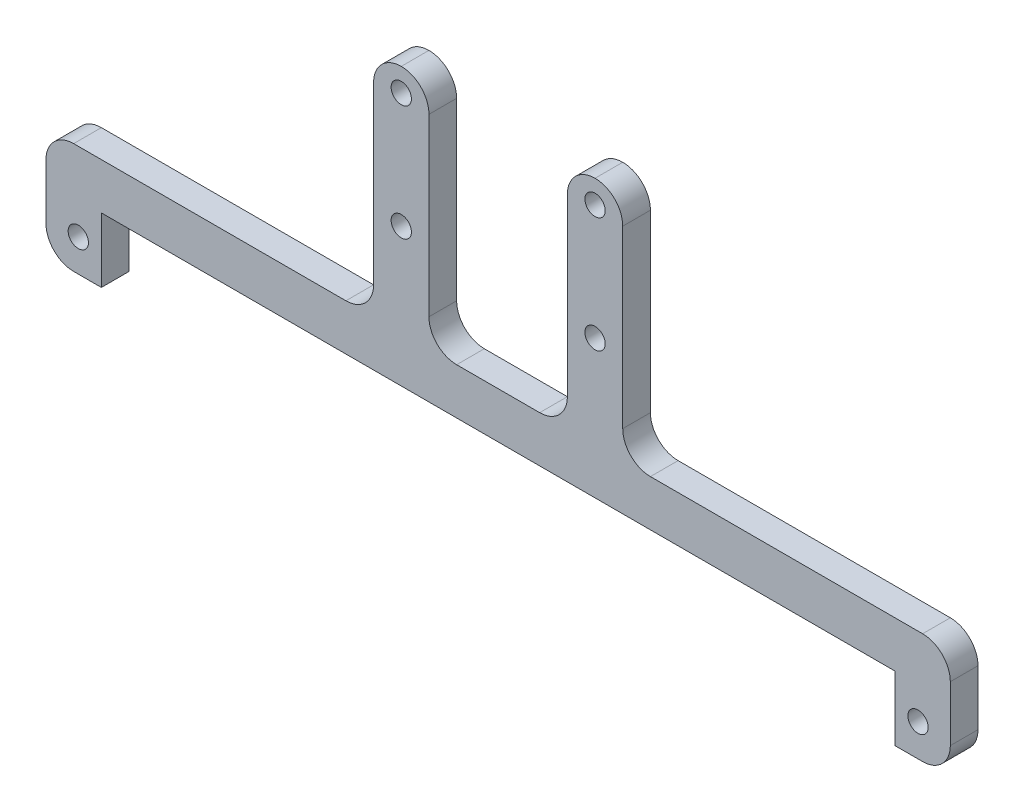
ISO-10303-21;
HEADER;
FILE_DESCRIPTION(('STEP AP214'),'2;1');
FILE_NAME('part.step','',(''),(''),'','','');
FILE_SCHEMA(('AUTOMOTIVE_DESIGN { 1 0 10303 214 1 1 1 1 }'));
ENDSEC;
DATA;
#1=APPLICATION_CONTEXT('core data for automotive mechanical design processes');
#2=APPLICATION_PROTOCOL_DEFINITION('international standard','automotive_design',2000,#1);
#3=PRODUCT_CONTEXT('',#1,'mechanical');
#4=PRODUCT('Part','Part','',(#3));
#5=PRODUCT_RELATED_PRODUCT_CATEGORY('part','',(#4));
#6=PRODUCT_DEFINITION_FORMATION('','',#4);
#7=PRODUCT_DEFINITION_CONTEXT('part definition',#1,'design');
#8=PRODUCT_DEFINITION('design','',#6,#7);
#9=PRODUCT_DEFINITION_SHAPE('','',#8);
#10=(LENGTH_UNIT() NAMED_UNIT(*) SI_UNIT(.MILLI.,.METRE.));
#11=(NAMED_UNIT(*) PLANE_ANGLE_UNIT() SI_UNIT($,.RADIAN.));
#12=(NAMED_UNIT(*) SI_UNIT($,.STERADIAN.) SOLID_ANGLE_UNIT());
#13=UNCERTAINTY_MEASURE_WITH_UNIT(LENGTH_MEASURE(1.E-05),#10,'distance_accuracy_value','');
#14=(GEOMETRIC_REPRESENTATION_CONTEXT(3) GLOBAL_UNCERTAINTY_ASSIGNED_CONTEXT((#13)) GLOBAL_UNIT_ASSIGNED_CONTEXT((#10,
#11,#12)) REPRESENTATION_CONTEXT('',''));
#15=CARTESIAN_POINT('',(0.,0.,0.));
#16=DIRECTION('',(0.,0.,1.));
#17=DIRECTION('',(1.,0.,0.));
#18=AXIS2_PLACEMENT_3D('',#15,#16,#17);
#19=CARTESIAN_POINT('',(0.,0.,3.));
#20=DIRECTION('',(0.,0.,-1.));
#21=DIRECTION('',(-1.,0.,0.));
#22=AXIS2_PLACEMENT_3D('',#19,#20,#21);
#23=PLANE('',#22);
#24=CARTESIAN_POINT('',(10.5,15.,3.));
#25=DIRECTION('',(0.,0.,-1.));
#26=DIRECTION('',(-1.,0.,0.));
#27=AXIS2_PLACEMENT_3D('',#24,#25,#26);
#28=CIRCLE('',#27,1.1);
#29=CARTESIAN_POINT('',(9.4,15.,3.));
#30=VERTEX_POINT('',#29);
#31=EDGE_CURVE('E503',#30,#30,#28,.T.);
#32=ORIENTED_EDGE('',*,*,#31,.T.);
#33=EDGE_LOOP('',(#32));
#34=FACE_BOUND('',#33,.T.);
#35=CARTESIAN_POINT('',(10.5,27.,3.));
#36=DIRECTION('',(0.,0.,-1.));
#37=DIRECTION('',(-1.,0.,0.));
#38=AXIS2_PLACEMENT_3D('',#35,#36,#37);
#39=CIRCLE('',#38,3.);
#40=CARTESIAN_POINT('',(13.5,27.,3.));
#41=VERTEX_POINT('',#40);
#42=CARTESIAN_POINT('',(10.5,30.,3.));
#43=VERTEX_POINT('',#42);
#44=EDGE_CURVE('E49',#41,#43,#39,.F.);
#45=ORIENTED_EDGE('',*,*,#44,.T.);
#46=CARTESIAN_POINT('',(10.5,27.,3.));
#47=DIRECTION('',(0.,0.,-1.));
#48=DIRECTION('',(-1.,0.,0.));
#49=AXIS2_PLACEMENT_3D('',#46,#47,#48);
#50=CIRCLE('',#49,3.);
#51=CARTESIAN_POINT('',(7.5,27.,3.));
#52=VERTEX_POINT('',#51);
#53=EDGE_CURVE('E392',#43,#52,#50,.F.);
#54=ORIENTED_EDGE('',*,*,#53,.T.);
#55=DIRECTION('',(0.,1.,0.));
#56=VECTOR('',#55,1.);
#57=CARTESIAN_POINT('',(7.5,5.,3.));
#58=LINE('',#57,#56);
#59=CARTESIAN_POINT('',(7.5,8.,3.));
#60=VERTEX_POINT('',#59);
#61=EDGE_CURVE('E230',#60,#52,#58,.T.);
#62=ORIENTED_EDGE('',*,*,#61,.F.);
#63=CARTESIAN_POINT('',(4.5,8.,3.));
#64=DIRECTION('',(0.,0.,-1.));
#65=DIRECTION('',(-1.,0.,0.));
#66=AXIS2_PLACEMENT_3D('',#63,#64,#65);
#67=CIRCLE('',#66,3.);
#68=CARTESIAN_POINT('',(4.5,5.,3.));
#69=VERTEX_POINT('',#68);
#70=EDGE_CURVE('E11',#60,#69,#67,.T.);
#71=ORIENTED_EDGE('',*,*,#70,.T.);
#72=DIRECTION('',(-1.,0.,0.));
#73=VECTOR('',#72,1.);
#74=CARTESIAN_POINT('',(0.,5.,3.));
#75=LINE('',#74,#73);
#76=CARTESIAN_POINT('',(-4.5,5.,3.));
#77=VERTEX_POINT('',#76);
#78=EDGE_CURVE('E269',#69,#77,#75,.T.);
#79=ORIENTED_EDGE('',*,*,#78,.T.);
#80=CARTESIAN_POINT('',(-4.5,8.,3.));
#81=DIRECTION('',(0.,0.,-1.));
#82=DIRECTION('',(-1.,0.,0.));
#83=AXIS2_PLACEMENT_3D('',#80,#81,#82);
#84=CIRCLE('',#83,3.);
#85=CARTESIAN_POINT('',(-7.5,8.,3.));
#86=VERTEX_POINT('',#85);
#87=EDGE_CURVE('E357',#77,#86,#84,.T.);
#88=ORIENTED_EDGE('',*,*,#87,.T.);
#89=DIRECTION('',(0.,1.,0.));
#90=VECTOR('',#89,1.);
#91=CARTESIAN_POINT('',(-7.5,5.,3.));
#92=LINE('',#91,#90);
#93=CARTESIAN_POINT('',(-7.5,27.,3.));
#94=VERTEX_POINT('',#93);
#95=EDGE_CURVE('E265',#86,#94,#92,.T.);
#96=ORIENTED_EDGE('',*,*,#95,.T.);
#97=CARTESIAN_POINT('',(-10.5,27.,3.));
#98=DIRECTION('',(0.,0.,-1.));
#99=DIRECTION('',(-1.,0.,0.));
#100=AXIS2_PLACEMENT_3D('',#97,#98,#99);
#101=CIRCLE('',#100,3.);
#102=CARTESIAN_POINT('',(-10.5,30.,3.));
#103=VERTEX_POINT('',#102);
#104=EDGE_CURVE('E340',#94,#103,#101,.F.);
#105=ORIENTED_EDGE('',*,*,#104,.T.);
#106=CARTESIAN_POINT('',(-10.5,27.,3.));
#107=DIRECTION('',(0.,0.,-1.));
#108=DIRECTION('',(-1.,0.,0.));
#109=AXIS2_PLACEMENT_3D('',#106,#107,#108);
#110=CIRCLE('',#109,3.);
#111=CARTESIAN_POINT('',(-13.5,27.,3.));
#112=VERTEX_POINT('',#111);
#113=EDGE_CURVE('E338',#103,#112,#110,.F.);
#114=ORIENTED_EDGE('',*,*,#113,.T.);
#115=DIRECTION('',(0.,1.,0.));
#116=VECTOR('',#115,1.);
#117=CARTESIAN_POINT('',(-13.5,4.99999999999999,3.));
#118=LINE('',#117,#116);
#119=CARTESIAN_POINT('',(-13.5,7.99999999999999,3.));
#120=VERTEX_POINT('',#119);
#121=EDGE_CURVE('E262',#120,#112,#118,.T.);
#122=ORIENTED_EDGE('',*,*,#121,.F.);
#123=CARTESIAN_POINT('',(-16.5,7.99999999999999,3.));
#124=DIRECTION('',(0.,0.,-1.));
#125=DIRECTION('',(-1.,0.,0.));
#126=AXIS2_PLACEMENT_3D('',#123,#124,#125);
#127=CIRCLE('',#126,3.);
#128=CARTESIAN_POINT('',(-16.5,5.,3.));
#129=VERTEX_POINT('',#128);
#130=EDGE_CURVE('E352',#120,#129,#127,.T.);
#131=ORIENTED_EDGE('',*,*,#130,.T.);
#132=DIRECTION('',(-1.,0.,0.));
#133=VECTOR('',#132,1.);
#134=CARTESIAN_POINT('',(-13.5,4.99999999999999,3.));
#135=LINE('',#134,#133);
#136=CARTESIAN_POINT('',(-46.,5.,3.));
#137=VERTEX_POINT('',#136);
#138=EDGE_CURVE('E280',#129,#137,#135,.T.);
#139=ORIENTED_EDGE('',*,*,#138,.T.);
#140=CARTESIAN_POINT('',(-46.,2.,3.));
#141=DIRECTION('',(0.,0.,-1.));
#142=DIRECTION('',(-1.,0.,0.));
#143=AXIS2_PLACEMENT_3D('',#140,#141,#142);
#144=CIRCLE('',#143,3.);
#145=CARTESIAN_POINT('',(-49.,2.,3.));
#146=VERTEX_POINT('',#145);
#147=EDGE_CURVE('E336',#137,#146,#144,.F.);
#148=ORIENTED_EDGE('',*,*,#147,.T.);
#149=DIRECTION('',(0.,-1.,0.));
#150=VECTOR('',#149,1.);
#151=CARTESIAN_POINT('',(-49.,0.,3.));
#152=LINE('',#151,#150);
#153=CARTESIAN_POINT('',(-49.,-4.,3.));
#154=VERTEX_POINT('',#153);
#155=EDGE_CURVE('E277',#146,#154,#152,.T.);
#156=ORIENTED_EDGE('',*,*,#155,.T.);
#157=CARTESIAN_POINT('',(-46.,-4.,3.));
#158=DIRECTION('',(0.,0.,-1.));
#159=DIRECTION('',(-1.,0.,0.));
#160=AXIS2_PLACEMENT_3D('',#157,#158,#159);
#161=CIRCLE('',#160,3.);
#162=CARTESIAN_POINT('',(-46.,-7.,3.));
#163=VERTEX_POINT('',#162);
#164=EDGE_CURVE('E334',#154,#163,#161,.F.);
#165=ORIENTED_EDGE('',*,*,#164,.T.);
#166=DIRECTION('',(1.,0.,0.));
#167=VECTOR('',#166,1.);
#168=CARTESIAN_POINT('',(-49.,-7.,3.));
#169=LINE('',#168,#167);
#170=CARTESIAN_POINT('',(-43.,-7.,3.));
#171=VERTEX_POINT('',#170);
#172=EDGE_CURVE('E275',#163,#171,#169,.T.);
#173=ORIENTED_EDGE('',*,*,#172,.T.);
#174=DIRECTION('',(0.,-1.,0.));
#175=VECTOR('',#174,1.);
#176=CARTESIAN_POINT('',(-43.,0.,3.));
#177=LINE('',#176,#175);
#178=CARTESIAN_POINT('',(-43.,0.,3.));
#179=VERTEX_POINT('',#178);
#180=EDGE_CURVE('E272',#179,#171,#177,.T.);
#181=ORIENTED_EDGE('',*,*,#180,.F.);
#182=DIRECTION('',(-1.,0.,0.));
#183=VECTOR('',#182,1.);
#184=CARTESIAN_POINT('',(0.,0.,3.));
#185=LINE('',#184,#183);
#186=CARTESIAN_POINT('',(43.,0.,3.));
#187=VERTEX_POINT('',#186);
#188=EDGE_CURVE('E226',#187,#179,#185,.T.);
#189=ORIENTED_EDGE('',*,*,#188,.F.);
#190=DIRECTION('',(0.,-1.,0.));
#191=VECTOR('',#190,1.);
#192=CARTESIAN_POINT('',(43.,0.,3.));
#193=LINE('',#192,#191);
#194=CARTESIAN_POINT('',(43.,-7.,3.));
#195=VERTEX_POINT('',#194);
#196=EDGE_CURVE('E219',#187,#195,#193,.T.);
#197=ORIENTED_EDGE('',*,*,#196,.T.);
#198=DIRECTION('',(-1.,0.,0.));
#199=VECTOR('',#198,1.);
#200=CARTESIAN_POINT('',(49.,-7.,3.));
#201=LINE('',#200,#199);
#202=CARTESIAN_POINT('',(46.,-7.,3.));
#203=VERTEX_POINT('',#202);
#204=EDGE_CURVE('E209',#203,#195,#201,.T.);
#205=ORIENTED_EDGE('',*,*,#204,.F.);
#206=CARTESIAN_POINT('',(46.,-4.,3.));
#207=DIRECTION('',(0.,0.,-1.));
#208=DIRECTION('',(-1.,0.,0.));
#209=AXIS2_PLACEMENT_3D('',#206,#207,#208);
#210=CIRCLE('',#209,3.);
#211=CARTESIAN_POINT('',(49.,-4.,3.));
#212=VERTEX_POINT('',#211);
#213=EDGE_CURVE('E387',#203,#212,#210,.F.);
#214=ORIENTED_EDGE('',*,*,#213,.T.);
#215=DIRECTION('',(0.,1.,0.));
#216=VECTOR('',#215,1.);
#217=CARTESIAN_POINT('',(49.,0.,3.));
#218=LINE('',#217,#216);
#219=CARTESIAN_POINT('',(49.,2.,3.));
#220=VERTEX_POINT('',#219);
#221=EDGE_CURVE('E220',#212,#220,#218,.T.);
#222=ORIENTED_EDGE('',*,*,#221,.T.);
#223=CARTESIAN_POINT('',(46.,2.,3.));
#224=DIRECTION('',(0.,0.,-1.));
#225=DIRECTION('',(-1.,0.,0.));
#226=AXIS2_PLACEMENT_3D('',#223,#224,#225);
#227=CIRCLE('',#226,3.);
#228=CARTESIAN_POINT('',(46.,5.,3.));
#229=VERTEX_POINT('',#228);
#230=EDGE_CURVE('E389',#220,#229,#227,.F.);
#231=ORIENTED_EDGE('',*,*,#230,.T.);
#232=DIRECTION('',(1.,0.,0.));
#233=VECTOR('',#232,1.);
#234=CARTESIAN_POINT('',(13.5,4.99999999999999,3.));
#235=LINE('',#234,#233);
#236=CARTESIAN_POINT('',(16.5,5.,3.));
#237=VERTEX_POINT('',#236);
#238=EDGE_CURVE('E493',#237,#229,#235,.T.);
#239=ORIENTED_EDGE('',*,*,#238,.F.);
#240=CARTESIAN_POINT('',(16.5,7.99999999999999,3.));
#241=DIRECTION('',(0.,0.,-1.));
#242=DIRECTION('',(-1.,0.,0.));
#243=AXIS2_PLACEMENT_3D('',#240,#241,#242);
#244=CIRCLE('',#243,3.);
#245=CARTESIAN_POINT('',(13.5,7.99999999999999,3.));
#246=VERTEX_POINT('',#245);
#247=EDGE_CURVE('E401',#237,#246,#244,.T.);
#248=ORIENTED_EDGE('',*,*,#247,.T.);
#249=DIRECTION('',(0.,1.,0.));
#250=VECTOR('',#249,1.);
#251=CARTESIAN_POINT('',(13.5,4.99999999999999,3.));
#252=LINE('',#251,#250);
#253=EDGE_CURVE('E417',#246,#41,#252,.T.);
#254=ORIENTED_EDGE('',*,*,#253,.T.);
#255=EDGE_LOOP('',(#45,#54,#62,#71,#79,#88,#96,#105,#114,#122,#131,#139,#148,#156,#165,#173,
#181,#189,#197,#205,#214,#222,#231,#239,#248,#254));
#256=FACE_BOUND('',#255,.T.);
#257=CARTESIAN_POINT('',(-45.5,-3.5,3.));
#258=DIRECTION('',(0.,0.,1.));
#259=DIRECTION('',(1.,0.,0.));
#260=AXIS2_PLACEMENT_3D('',#257,#258,#259);
#261=CIRCLE('',#260,1.1);
#262=CARTESIAN_POINT('',(-44.4,-3.5,3.));
#263=VERTEX_POINT('',#262);
#264=EDGE_CURVE('E253',#263,#263,#261,.T.);
#265=ORIENTED_EDGE('',*,*,#264,.F.);
#266=EDGE_LOOP('',(#265));
#267=FACE_BOUND('',#266,.T.);
#268=CARTESIAN_POINT('',(-10.5,15.,3.));
#269=DIRECTION('',(0.,0.,1.));
#270=DIRECTION('',(1.,0.,0.));
#271=AXIS2_PLACEMENT_3D('',#268,#269,#270);
#272=CIRCLE('',#271,1.1);
#273=CARTESIAN_POINT('',(-9.4,15.,3.));
#274=VERTEX_POINT('',#273);
#275=EDGE_CURVE('E246',#274,#274,#272,.T.);
#276=ORIENTED_EDGE('',*,*,#275,.F.);
#277=EDGE_LOOP('',(#276));
#278=FACE_BOUND('',#277,.T.);
#279=CARTESIAN_POINT('',(-10.5,27.5,3.));
#280=DIRECTION('',(0.,0.,1.));
#281=DIRECTION('',(1.,0.,0.));
#282=AXIS2_PLACEMENT_3D('',#279,#280,#281);
#283=CIRCLE('',#282,1.1);
#284=CARTESIAN_POINT('',(-9.4,27.5,3.));
#285=VERTEX_POINT('',#284);
#286=EDGE_CURVE('E247',#285,#285,#283,.T.);
#287=ORIENTED_EDGE('',*,*,#286,.F.);
#288=EDGE_LOOP('',(#287));
#289=FACE_BOUND('',#288,.T.);
#290=CARTESIAN_POINT('',(45.5,-3.5,3.));
#291=DIRECTION('',(0.,0.,-1.));
#292=DIRECTION('',(-1.,0.,0.));
#293=AXIS2_PLACEMENT_3D('',#290,#291,#292);
#294=CIRCLE('',#293,1.1);
#295=CARTESIAN_POINT('',(44.4,-3.5,3.));
#296=VERTEX_POINT('',#295);
#297=EDGE_CURVE('E497',#296,#296,#294,.T.);
#298=ORIENTED_EDGE('',*,*,#297,.T.);
#299=EDGE_LOOP('',(#298));
#300=FACE_BOUND('',#299,.T.);
#301=CARTESIAN_POINT('',(10.5,27.5,3.));
#302=DIRECTION('',(0.,0.,-1.));
#303=DIRECTION('',(-1.,0.,0.));
#304=AXIS2_PLACEMENT_3D('',#301,#302,#303);
#305=CIRCLE('',#304,1.1);
#306=CARTESIAN_POINT('',(9.4,27.5,3.));
#307=VERTEX_POINT('',#306);
#308=EDGE_CURVE('E509',#307,#307,#305,.T.);
#309=ORIENTED_EDGE('',*,*,#308,.T.);
#310=EDGE_LOOP('',(#309));
#311=FACE_BOUND('',#310,.T.);
#312=ADVANCED_FACE('F33',(#34,#256,#267,#278,#289,#300,#311),#23,.F.);
#313=CARTESIAN_POINT('',(0.,0.,0.));
#314=DIRECTION('',(0.,0.,-1.));
#315=DIRECTION('',(-1.,0.,0.));
#316=AXIS2_PLACEMENT_3D('',#313,#314,#315);
#317=PLANE('',#316);
#318=CARTESIAN_POINT('',(10.5,15.,0.));
#319=DIRECTION('',(0.,0.,-1.));
#320=DIRECTION('',(-1.,0.,0.));
#321=AXIS2_PLACEMENT_3D('',#318,#319,#320);
#322=CIRCLE('',#321,1.1);
#323=CARTESIAN_POINT('',(9.4,15.,0.));
#324=VERTEX_POINT('',#323);
#325=EDGE_CURVE('E500',#324,#324,#322,.T.);
#326=ORIENTED_EDGE('',*,*,#325,.F.);
#327=EDGE_LOOP('',(#326));
#328=FACE_BOUND('',#327,.T.);
#329=DIRECTION('',(0.,1.,0.));
#330=VECTOR('',#329,1.);
#331=CARTESIAN_POINT('',(7.5,5.,0.));
#332=LINE('',#331,#330);
#333=CARTESIAN_POINT('',(7.5,8.,0.));
#334=VERTEX_POINT('',#333);
#335=CARTESIAN_POINT('',(7.5,27.,0.));
#336=VERTEX_POINT('',#335);
#337=EDGE_CURVE('E409',#334,#336,#332,.T.);
#338=ORIENTED_EDGE('',*,*,#337,.T.);
#339=CARTESIAN_POINT('',(10.5,27.,0.));
#340=DIRECTION('',(0.,0.,-1.));
#341=DIRECTION('',(-1.,0.,0.));
#342=AXIS2_PLACEMENT_3D('',#339,#340,#341);
#343=CIRCLE('',#342,3.);
#344=CARTESIAN_POINT('',(10.5,30.,0.));
#345=VERTEX_POINT('',#344);
#346=EDGE_CURVE('E385',#336,#345,#343,.T.);
#347=ORIENTED_EDGE('',*,*,#346,.T.);
#348=CARTESIAN_POINT('',(10.5,27.,0.));
#349=DIRECTION('',(0.,0.,-1.));
#350=DIRECTION('',(-1.,0.,0.));
#351=AXIS2_PLACEMENT_3D('',#348,#349,#350);
#352=CIRCLE('',#351,3.);
#353=CARTESIAN_POINT('',(13.5,27.,0.));
#354=VERTEX_POINT('',#353);
#355=EDGE_CURVE('E383',#345,#354,#352,.T.);
#356=ORIENTED_EDGE('',*,*,#355,.T.);
#357=DIRECTION('',(0.,1.,0.));
#358=VECTOR('',#357,1.);
#359=CARTESIAN_POINT('',(13.5,4.99999999999999,0.));
#360=LINE('',#359,#358);
#361=CARTESIAN_POINT('',(13.5,7.99999999999999,0.));
#362=VERTEX_POINT('',#361);
#363=EDGE_CURVE('E488',#362,#354,#360,.T.);
#364=ORIENTED_EDGE('',*,*,#363,.F.);
#365=CARTESIAN_POINT('',(16.5,7.99999999999999,0.));
#366=DIRECTION('',(0.,0.,-1.));
#367=DIRECTION('',(-1.,0.,0.));
#368=AXIS2_PLACEMENT_3D('',#365,#366,#367);
#369=CIRCLE('',#368,3.);
#370=CARTESIAN_POINT('',(16.5,5.,0.));
#371=VERTEX_POINT('',#370);
#372=EDGE_CURVE('E399',#362,#371,#369,.F.);
#373=ORIENTED_EDGE('',*,*,#372,.T.);
#374=DIRECTION('',(1.,0.,0.));
#375=VECTOR('',#374,1.);
#376=CARTESIAN_POINT('',(13.5,4.99999999999999,0.));
#377=LINE('',#376,#375);
#378=CARTESIAN_POINT('',(46.,5.,0.));
#379=VERTEX_POINT('',#378);
#380=EDGE_CURVE('E485',#371,#379,#377,.T.);
#381=ORIENTED_EDGE('',*,*,#380,.T.);
#382=CARTESIAN_POINT('',(46.,2.,0.));
#383=DIRECTION('',(0.,0.,-1.));
#384=DIRECTION('',(-1.,0.,0.));
#385=AXIS2_PLACEMENT_3D('',#382,#383,#384);
#386=CIRCLE('',#385,3.);
#387=CARTESIAN_POINT('',(49.,2.,0.));
#388=VERTEX_POINT('',#387);
#389=EDGE_CURVE('E381',#379,#388,#386,.T.);
#390=ORIENTED_EDGE('',*,*,#389,.T.);
#391=DIRECTION('',(0.,-1.,0.));
#392=VECTOR('',#391,1.);
#393=CARTESIAN_POINT('',(49.,0.,0.));
#394=LINE('',#393,#392);
#395=CARTESIAN_POINT('',(49.,-4.,0.));
#396=VERTEX_POINT('',#395);
#397=EDGE_CURVE('E480',#388,#396,#394,.T.);
#398=ORIENTED_EDGE('',*,*,#397,.T.);
#399=CARTESIAN_POINT('',(46.,-4.,0.));
#400=DIRECTION('',(0.,0.,-1.));
#401=DIRECTION('',(-1.,0.,0.));
#402=AXIS2_PLACEMENT_3D('',#399,#400,#401);
#403=CIRCLE('',#402,3.);
#404=CARTESIAN_POINT('',(46.,-7.,0.));
#405=VERTEX_POINT('',#404);
#406=EDGE_CURVE('E379',#396,#405,#403,.T.);
#407=ORIENTED_EDGE('',*,*,#406,.T.);
#408=DIRECTION('',(-1.,0.,0.));
#409=VECTOR('',#408,1.);
#410=CARTESIAN_POINT('',(49.,-7.,0.));
#411=LINE('',#410,#409);
#412=CARTESIAN_POINT('',(43.,-7.,0.));
#413=VERTEX_POINT('',#412);
#414=EDGE_CURVE('E478',#405,#413,#411,.T.);
#415=ORIENTED_EDGE('',*,*,#414,.T.);
#416=DIRECTION('',(0.,-1.,0.));
#417=VECTOR('',#416,1.);
#418=CARTESIAN_POINT('',(43.,0.,0.));
#419=LINE('',#418,#417);
#420=CARTESIAN_POINT('',(43.,0.,0.));
#421=VERTEX_POINT('',#420);
#422=EDGE_CURVE('E234',#421,#413,#419,.T.);
#423=ORIENTED_EDGE('',*,*,#422,.F.);
#424=DIRECTION('',(-1.,0.,0.));
#425=VECTOR('',#424,1.);
#426=CARTESIAN_POINT('',(0.,0.,0.));
#427=LINE('',#426,#425);
#428=CARTESIAN_POINT('',(-43.,0.,0.));
#429=VERTEX_POINT('',#428);
#430=EDGE_CURVE('E291',#421,#429,#427,.T.);
#431=ORIENTED_EDGE('',*,*,#430,.T.);
#432=DIRECTION('',(0.,-1.,0.));
#433=VECTOR('',#432,1.);
#434=CARTESIAN_POINT('',(-43.,0.,0.));
#435=LINE('',#434,#433);
#436=CARTESIAN_POINT('',(-43.,-7.,0.));
#437=VERTEX_POINT('',#436);
#438=EDGE_CURVE('E294',#429,#437,#435,.T.);
#439=ORIENTED_EDGE('',*,*,#438,.T.);
#440=DIRECTION('',(1.,0.,0.));
#441=VECTOR('',#440,1.);
#442=CARTESIAN_POINT('',(-49.,-7.,0.));
#443=LINE('',#442,#441);
#444=CARTESIAN_POINT('',(-46.,-7.,0.));
#445=VERTEX_POINT('',#444);
#446=EDGE_CURVE('E297',#445,#437,#443,.T.);
#447=ORIENTED_EDGE('',*,*,#446,.F.);
#448=CARTESIAN_POINT('',(-46.,-4.,0.));
#449=DIRECTION('',(0.,0.,-1.));
#450=DIRECTION('',(-1.,0.,0.));
#451=AXIS2_PLACEMENT_3D('',#448,#449,#450);
#452=CIRCLE('',#451,3.);
#453=CARTESIAN_POINT('',(-49.,-4.,0.));
#454=VERTEX_POINT('',#453);
#455=EDGE_CURVE('E326',#445,#454,#452,.T.);
#456=ORIENTED_EDGE('',*,*,#455,.T.);
#457=DIRECTION('',(0.,1.,0.));
#458=VECTOR('',#457,1.);
#459=CARTESIAN_POINT('',(-49.,0.,0.));
#460=LINE('',#459,#458);
#461=CARTESIAN_POINT('',(-49.,2.,0.));
#462=VERTEX_POINT('',#461);
#463=EDGE_CURVE('E299',#454,#462,#460,.T.);
#464=ORIENTED_EDGE('',*,*,#463,.T.);
#465=CARTESIAN_POINT('',(-46.,2.,0.));
#466=DIRECTION('',(0.,0.,-1.));
#467=DIRECTION('',(-1.,0.,0.));
#468=AXIS2_PLACEMENT_3D('',#465,#466,#467);
#469=CIRCLE('',#468,3.);
#470=CARTESIAN_POINT('',(-46.,5.,0.));
#471=VERTEX_POINT('',#470);
#472=EDGE_CURVE('E328',#462,#471,#469,.T.);
#473=ORIENTED_EDGE('',*,*,#472,.T.);
#474=DIRECTION('',(-1.,0.,0.));
#475=VECTOR('',#474,1.);
#476=CARTESIAN_POINT('',(-13.5,4.99999999999999,0.));
#477=LINE('',#476,#475);
#478=CARTESIAN_POINT('',(-16.5,5.,0.));
#479=VERTEX_POINT('',#478);
#480=EDGE_CURVE('E266',#479,#471,#477,.T.);
#481=ORIENTED_EDGE('',*,*,#480,.F.);
#482=CARTESIAN_POINT('',(-16.5,7.99999999999999,0.));
#483=DIRECTION('',(0.,0.,-1.));
#484=DIRECTION('',(-1.,0.,0.));
#485=AXIS2_PLACEMENT_3D('',#482,#483,#484);
#486=CIRCLE('',#485,3.);
#487=CARTESIAN_POINT('',(-13.5,7.99999999999999,0.));
#488=VERTEX_POINT('',#487);
#489=EDGE_CURVE('E350',#479,#488,#486,.F.);
#490=ORIENTED_EDGE('',*,*,#489,.T.);
#491=DIRECTION('',(0.,1.,0.));
#492=VECTOR('',#491,1.);
#493=CARTESIAN_POINT('',(-13.5,4.99999999999999,0.));
#494=LINE('',#493,#492);
#495=CARTESIAN_POINT('',(-13.5,27.,0.));
#496=VERTEX_POINT('',#495);
#497=EDGE_CURVE('E259',#488,#496,#494,.T.);
#498=ORIENTED_EDGE('',*,*,#497,.T.);
#499=CARTESIAN_POINT('',(-10.5,27.,0.));
#500=DIRECTION('',(0.,0.,-1.));
#501=DIRECTION('',(-1.,0.,0.));
#502=AXIS2_PLACEMENT_3D('',#499,#500,#501);
#503=CIRCLE('',#502,3.);
#504=CARTESIAN_POINT('',(-10.5,30.,0.));
#505=VERTEX_POINT('',#504);
#506=EDGE_CURVE('E330',#496,#505,#503,.T.);
#507=ORIENTED_EDGE('',*,*,#506,.T.);
#508=CARTESIAN_POINT('',(-10.5,27.,0.));
#509=DIRECTION('',(0.,0.,-1.));
#510=DIRECTION('',(-1.,0.,0.));
#511=AXIS2_PLACEMENT_3D('',#508,#509,#510);
#512=CIRCLE('',#511,3.);
#513=CARTESIAN_POINT('',(-7.5,27.,0.));
#514=VERTEX_POINT('',#513);
#515=EDGE_CURVE('E332',#505,#514,#512,.T.);
#516=ORIENTED_EDGE('',*,*,#515,.T.);
#517=DIRECTION('',(0.,1.,0.));
#518=VECTOR('',#517,1.);
#519=CARTESIAN_POINT('',(-7.5,5.,0.));
#520=LINE('',#519,#518);
#521=CARTESIAN_POINT('',(-7.5,8.,0.));
#522=VERTEX_POINT('',#521);
#523=EDGE_CURVE('E286',#522,#514,#520,.T.);
#524=ORIENTED_EDGE('',*,*,#523,.F.);
#525=CARTESIAN_POINT('',(-4.5,8.,0.));
#526=DIRECTION('',(0.,0.,-1.));
#527=DIRECTION('',(-1.,0.,0.));
#528=AXIS2_PLACEMENT_3D('',#525,#526,#527);
#529=CIRCLE('',#528,3.);
#530=CARTESIAN_POINT('',(-4.5,5.,0.));
#531=VERTEX_POINT('',#530);
#532=EDGE_CURVE('E354',#522,#531,#529,.F.);
#533=ORIENTED_EDGE('',*,*,#532,.T.);
#534=DIRECTION('',(-1.,0.,0.));
#535=VECTOR('',#534,1.);
#536=CARTESIAN_POINT('',(0.,5.,0.));
#537=LINE('',#536,#535);
#538=CARTESIAN_POINT('',(4.5,5.,0.));
#539=VERTEX_POINT('',#538);
#540=EDGE_CURVE('E289',#539,#531,#537,.T.);
#541=ORIENTED_EDGE('',*,*,#540,.F.);
#542=CARTESIAN_POINT('',(4.5,8.,0.));
#543=DIRECTION('',(0.,0.,-1.));
#544=DIRECTION('',(-1.,0.,0.));
#545=AXIS2_PLACEMENT_3D('',#542,#543,#544);
#546=CIRCLE('',#545,3.);
#547=EDGE_CURVE('E42',#539,#334,#546,.F.);
#548=ORIENTED_EDGE('',*,*,#547,.T.);
#549=EDGE_LOOP('',(#338,#347,#356,#364,#373,#381,#390,#398,#407,#415,#423,#431,#439,#447,#456,
#464,#473,#481,#490,#498,#507,#516,#524,#533,#541,#548));
#550=FACE_BOUND('',#549,.T.);
#551=CARTESIAN_POINT('',(-45.5,-3.5,0.));
#552=DIRECTION('',(0.,0.,1.));
#553=DIRECTION('',(1.,0.,0.));
#554=AXIS2_PLACEMENT_3D('',#551,#552,#553);
#555=CIRCLE('',#554,1.1);
#556=CARTESIAN_POINT('',(-44.4,-3.5,0.));
#557=VERTEX_POINT('',#556);
#558=EDGE_CURVE('E256',#557,#557,#555,.T.);
#559=ORIENTED_EDGE('',*,*,#558,.T.);
#560=EDGE_LOOP('',(#559));
#561=FACE_BOUND('',#560,.T.);
#562=CARTESIAN_POINT('',(-10.5,15.,0.));
#563=DIRECTION('',(0.,0.,1.));
#564=DIRECTION('',(1.,0.,0.));
#565=AXIS2_PLACEMENT_3D('',#562,#563,#564);
#566=CIRCLE('',#565,1.1);
#567=CARTESIAN_POINT('',(-9.4,15.,0.));
#568=VERTEX_POINT('',#567);
#569=EDGE_CURVE('E250',#568,#568,#566,.T.);
#570=ORIENTED_EDGE('',*,*,#569,.T.);
#571=EDGE_LOOP('',(#570));
#572=FACE_BOUND('',#571,.T.);
#573=CARTESIAN_POINT('',(-10.5,27.5,0.));
#574=DIRECTION('',(0.,0.,1.));
#575=DIRECTION('',(1.,0.,0.));
#576=AXIS2_PLACEMENT_3D('',#573,#574,#575);
#577=CIRCLE('',#576,1.1);
#578=CARTESIAN_POINT('',(-9.4,27.5,0.));
#579=VERTEX_POINT('',#578);
#580=EDGE_CURVE('E243',#579,#579,#577,.T.);
#581=ORIENTED_EDGE('',*,*,#580,.T.);
#582=EDGE_LOOP('',(#581));
#583=FACE_BOUND('',#582,.T.);
#584=CARTESIAN_POINT('',(45.5,-3.5,0.));
#585=DIRECTION('',(0.,0.,-1.));
#586=DIRECTION('',(-1.,0.,0.));
#587=AXIS2_PLACEMENT_3D('',#584,#585,#586);
#588=CIRCLE('',#587,1.1);
#589=CARTESIAN_POINT('',(44.4,-3.5,0.));
#590=VERTEX_POINT('',#589);
#591=EDGE_CURVE('E490',#590,#590,#588,.T.);
#592=ORIENTED_EDGE('',*,*,#591,.F.);
#593=EDGE_LOOP('',(#592));
#594=FACE_BOUND('',#593,.T.);
#595=CARTESIAN_POINT('',(10.5,27.5,0.));
#596=DIRECTION('',(0.,0.,-1.));
#597=DIRECTION('',(-1.,0.,0.));
#598=AXIS2_PLACEMENT_3D('',#595,#596,#597);
#599=CIRCLE('',#598,1.1);
#600=CARTESIAN_POINT('',(9.4,27.5,0.));
#601=VERTEX_POINT('',#600);
#602=EDGE_CURVE('E506',#601,#601,#599,.T.);
#603=ORIENTED_EDGE('',*,*,#602,.F.);
#604=EDGE_LOOP('',(#603));
#605=FACE_BOUND('',#604,.T.);
#606=ADVANCED_FACE('F407',(#328,#550,#561,#572,#583,#594,#605),#317,.T.);
#607=CARTESIAN_POINT('',(-13.5,4.99999999999999,3.));
#608=DIRECTION('',(-1.,0.,0.));
#609=DIRECTION('',(0.,0.,1.));
#610=AXIS2_PLACEMENT_3D('',#607,#608,#609);
#611=PLANE('',#610);
#612=ORIENTED_EDGE('',*,*,#497,.F.);
#613=DIRECTION('',(0.,0.,-1.));
#614=VECTOR('',#613,1.);
#615=CARTESIAN_POINT('',(-13.5,7.99999999999999,3.));
#616=LINE('',#615,#614);
#617=EDGE_CURVE('E315',#488,#120,#616,.F.);
#618=ORIENTED_EDGE('',*,*,#617,.T.);
#619=ORIENTED_EDGE('',*,*,#121,.T.);
#620=DIRECTION('',(0.,0.,-1.));
#621=VECTOR('',#620,1.);
#622=CARTESIAN_POINT('',(-13.5,27.,3.));
#623=LINE('',#622,#621);
#624=EDGE_CURVE('E313',#112,#496,#623,.T.);
#625=ORIENTED_EDGE('',*,*,#624,.T.);
#626=EDGE_LOOP('',(#612,#618,#619,#625));
#627=FACE_BOUND('',#626,.T.);
#628=ADVANCED_FACE('F445',(#627),#611,.T.);
#629=CARTESIAN_POINT('',(-13.5,4.99999999999999,3.));
#630=DIRECTION('',(0.,-1.,0.));
#631=DIRECTION('',(1.,0.,0.));
#632=AXIS2_PLACEMENT_3D('',#629,#630,#631);
#633=PLANE('',#632);
#634=ORIENTED_EDGE('',*,*,#138,.F.);
#635=DIRECTION('',(0.,0.,-1.));
#636=VECTOR('',#635,1.);
#637=CARTESIAN_POINT('',(-16.5,5.,3.));
#638=LINE('',#637,#636);
#639=EDGE_CURVE('E310',#129,#479,#638,.T.);
#640=ORIENTED_EDGE('',*,*,#639,.T.);
#641=ORIENTED_EDGE('',*,*,#480,.T.);
#642=DIRECTION('',(0.,0.,-1.));
#643=VECTOR('',#642,1.);
#644=CARTESIAN_POINT('',(-46.,5.,3.));
#645=LINE('',#644,#643);
#646=EDGE_CURVE('E307',#471,#137,#645,.F.);
#647=ORIENTED_EDGE('',*,*,#646,.T.);
#648=EDGE_LOOP('',(#634,#640,#641,#647));
#649=FACE_BOUND('',#648,.T.);
#650=ADVANCED_FACE('F454',(#649),#633,.F.);
#651=CARTESIAN_POINT('',(-49.,0.,3.));
#652=DIRECTION('',(-1.,0.,0.));
#653=DIRECTION('',(0.,0.,1.));
#654=AXIS2_PLACEMENT_3D('',#651,#652,#653);
#655=PLANE('',#654);
#656=ORIENTED_EDGE('',*,*,#155,.F.);
#657=DIRECTION('',(0.,0.,-1.));
#658=VECTOR('',#657,1.);
#659=CARTESIAN_POINT('',(-49.,2.,0.));
#660=LINE('',#659,#658);
#661=EDGE_CURVE('E344',#146,#462,#660,.T.);
#662=ORIENTED_EDGE('',*,*,#661,.T.);
#663=ORIENTED_EDGE('',*,*,#463,.F.);
#664=DIRECTION('',(0.,0.,-1.));
#665=VECTOR('',#664,1.);
#666=CARTESIAN_POINT('',(-49.,-4.,3.));
#667=LINE('',#666,#665);
#668=EDGE_CURVE('E342',#454,#154,#667,.F.);
#669=ORIENTED_EDGE('',*,*,#668,.T.);
#670=EDGE_LOOP('',(#656,#662,#663,#669));
#671=FACE_BOUND('',#670,.T.);
#672=ADVANCED_FACE('F463',(#671),#655,.T.);
#673=CARTESIAN_POINT('',(-49.,-7.,3.));
#674=DIRECTION('',(0.,1.,0.));
#675=DIRECTION('',(0.,0.,1.));
#676=AXIS2_PLACEMENT_3D('',#673,#674,#675);
#677=PLANE('',#676);
#678=ORIENTED_EDGE('',*,*,#172,.F.);
#679=DIRECTION('',(0.,0.,-1.));
#680=VECTOR('',#679,1.);
#681=CARTESIAN_POINT('',(-46.,-7.,0.));
#682=LINE('',#681,#680);
#683=EDGE_CURVE('E347',#163,#445,#682,.T.);
#684=ORIENTED_EDGE('',*,*,#683,.T.);
#685=ORIENTED_EDGE('',*,*,#446,.T.);
#686=DIRECTION('',(0.,0.,-1.));
#687=VECTOR('',#686,1.);
#688=CARTESIAN_POINT('',(-43.,-7.,3.));
#689=LINE('',#688,#687);
#690=EDGE_CURVE('E304',#171,#437,#689,.T.);
#691=ORIENTED_EDGE('',*,*,#690,.F.);
#692=EDGE_LOOP('',(#678,#684,#685,#691));
#693=FACE_BOUND('',#692,.T.);
#694=ADVANCED_FACE('F472',(#693),#677,.F.);
#695=CARTESIAN_POINT('',(-43.,0.,3.));
#696=DIRECTION('',(1.,0.,0.));
#697=DIRECTION('',(0.,0.,-1.));
#698=AXIS2_PLACEMENT_3D('',#695,#696,#697);
#699=PLANE('',#698);
#700=ORIENTED_EDGE('',*,*,#438,.F.);
#701=DIRECTION('',(0.,0.,-1.));
#702=VECTOR('',#701,1.);
#703=CARTESIAN_POINT('',(-43.,0.,3.));
#704=LINE('',#703,#702);
#705=EDGE_CURVE('E283',#179,#429,#704,.T.);
#706=ORIENTED_EDGE('',*,*,#705,.F.);
#707=ORIENTED_EDGE('',*,*,#180,.T.);
#708=ORIENTED_EDGE('',*,*,#690,.T.);
#709=EDGE_LOOP('',(#700,#706,#707,#708));
#710=FACE_BOUND('',#709,.T.);
#711=ADVANCED_FACE('F538',(#710),#699,.T.);
#712=CARTESIAN_POINT('',(0.,0.,3.));
#713=DIRECTION('',(0.,-1.,0.));
#714=DIRECTION('',(1.,0.,0.));
#715=AXIS2_PLACEMENT_3D('',#712,#713,#714);
#716=PLANE('',#715);
#717=ORIENTED_EDGE('',*,*,#430,.F.);
#718=DIRECTION('',(0.,0.,-1.));
#719=VECTOR('',#718,1.);
#720=CARTESIAN_POINT('',(43.,0.,3.));
#721=LINE('',#720,#719);
#722=EDGE_CURVE('E235',#187,#421,#721,.T.);
#723=ORIENTED_EDGE('',*,*,#722,.F.);
#724=ORIENTED_EDGE('',*,*,#188,.T.);
#725=ORIENTED_EDGE('',*,*,#705,.T.);
#726=EDGE_LOOP('',(#717,#723,#724,#725));
#727=FACE_BOUND('',#726,.T.);
#728=ADVANCED_FACE('F476',(#727),#716,.T.);
#729=CARTESIAN_POINT('',(0.,5.,3.));
#730=DIRECTION('',(0.,-1.,0.));
#731=DIRECTION('',(1.,0.,0.));
#732=AXIS2_PLACEMENT_3D('',#729,#730,#731);
#733=PLANE('',#732);
#734=ORIENTED_EDGE('',*,*,#78,.F.);
#735=DIRECTION('',(0.,0.,-1.));
#736=VECTOR('',#735,1.);
#737=CARTESIAN_POINT('',(4.5,5.,3.));
#738=LINE('',#737,#736);
#739=EDGE_CURVE('E371',#69,#539,#738,.T.);
#740=ORIENTED_EDGE('',*,*,#739,.T.);
#741=ORIENTED_EDGE('',*,*,#540,.T.);
#742=DIRECTION('',(0.,0.,-1.));
#743=VECTOR('',#742,1.);
#744=CARTESIAN_POINT('',(-4.5,5.,3.));
#745=LINE('',#744,#743);
#746=EDGE_CURVE('E323',#531,#77,#745,.F.);
#747=ORIENTED_EDGE('',*,*,#746,.T.);
#748=EDGE_LOOP('',(#734,#740,#741,#747));
#749=FACE_BOUND('',#748,.T.);
#750=ADVANCED_FACE('F422',(#749),#733,.F.);
#751=CARTESIAN_POINT('',(-7.5,5.,3.));
#752=DIRECTION('',(-1.,0.,0.));
#753=DIRECTION('',(0.,0.,1.));
#754=AXIS2_PLACEMENT_3D('',#751,#752,#753);
#755=PLANE('',#754);
#756=ORIENTED_EDGE('',*,*,#95,.F.);
#757=DIRECTION('',(0.,0.,-1.));
#758=VECTOR('',#757,1.);
#759=CARTESIAN_POINT('',(-7.5,8.,0.));
#760=LINE('',#759,#758);
#761=EDGE_CURVE('E320',#86,#522,#760,.T.);
#762=ORIENTED_EDGE('',*,*,#761,.T.);
#763=ORIENTED_EDGE('',*,*,#523,.T.);
#764=DIRECTION('',(0.,0.,-1.));
#765=VECTOR('',#764,1.);
#766=CARTESIAN_POINT('',(-7.5,27.,3.));
#767=LINE('',#766,#765);
#768=EDGE_CURVE('E317',#514,#94,#767,.F.);
#769=ORIENTED_EDGE('',*,*,#768,.T.);
#770=EDGE_LOOP('',(#756,#762,#763,#769));
#771=FACE_BOUND('',#770,.T.);
#772=ADVANCED_FACE('F430',(#771),#755,.F.);
#773=CARTESIAN_POINT('',(-45.5,-3.5,0.));
#774=DIRECTION('',(0.,0.,1.));
#775=DIRECTION('',(1.,0.,0.));
#776=AXIS2_PLACEMENT_3D('',#773,#774,#775);
#777=CYLINDRICAL_SURFACE('',#776,1.1);
#778=ORIENTED_EDGE('',*,*,#558,.F.);
#779=EDGE_LOOP('',(#778));
#780=FACE_BOUND('',#779,.T.);
#781=ORIENTED_EDGE('',*,*,#264,.T.);
#782=EDGE_LOOP('',(#781));
#783=FACE_BOUND('',#782,.T.);
#784=ADVANCED_FACE('F545',(#780,#783),#777,.F.);
#785=CARTESIAN_POINT('',(-10.5,15.,0.));
#786=DIRECTION('',(0.,0.,1.));
#787=DIRECTION('',(1.,0.,0.));
#788=AXIS2_PLACEMENT_3D('',#785,#786,#787);
#789=CYLINDRICAL_SURFACE('',#788,1.1);
#790=ORIENTED_EDGE('',*,*,#569,.F.);
#791=EDGE_LOOP('',(#790));
#792=FACE_BOUND('',#791,.T.);
#793=ORIENTED_EDGE('',*,*,#275,.T.);
#794=EDGE_LOOP('',(#793));
#795=FACE_BOUND('',#794,.T.);
#796=ADVANCED_FACE('F614',(#792,#795),#789,.F.);
#797=CARTESIAN_POINT('',(-10.5,27.5,0.));
#798=DIRECTION('',(0.,0.,1.));
#799=DIRECTION('',(1.,0.,0.));
#800=AXIS2_PLACEMENT_3D('',#797,#798,#799);
#801=CYLINDRICAL_SURFACE('',#800,1.1);
#802=ORIENTED_EDGE('',*,*,#580,.F.);
#803=EDGE_LOOP('',(#802));
#804=FACE_BOUND('',#803,.T.);
#805=ORIENTED_EDGE('',*,*,#286,.T.);
#806=EDGE_LOOP('',(#805));
#807=FACE_BOUND('',#806,.T.);
#808=ADVANCED_FACE('F549',(#804,#807),#801,.F.);
#809=CARTESIAN_POINT('',(-16.5,7.99999999999999,3.));
#810=DIRECTION('',(0.,0.,-1.));
#811=DIRECTION('',(-1.,0.,0.));
#812=AXIS2_PLACEMENT_3D('',#809,#810,#811);
#813=CYLINDRICAL_SURFACE('',#812,3.);
#814=ORIENTED_EDGE('',*,*,#130,.F.);
#815=ORIENTED_EDGE('',*,*,#617,.F.);
#816=ORIENTED_EDGE('',*,*,#489,.F.);
#817=ORIENTED_EDGE('',*,*,#639,.F.);
#818=EDGE_LOOP('',(#814,#815,#816,#817));
#819=FACE_BOUND('',#818,.T.);
#820=ADVANCED_FACE('F451',(#819),#813,.F.);
#821=CARTESIAN_POINT('',(-4.5,8.,3.));
#822=DIRECTION('',(0.,0.,1.));
#823=DIRECTION('',(1.,0.,0.));
#824=AXIS2_PLACEMENT_3D('',#821,#822,#823);
#825=CYLINDRICAL_SURFACE('',#824,3.);
#826=ORIENTED_EDGE('',*,*,#87,.F.);
#827=ORIENTED_EDGE('',*,*,#746,.F.);
#828=ORIENTED_EDGE('',*,*,#532,.F.);
#829=ORIENTED_EDGE('',*,*,#761,.F.);
#830=EDGE_LOOP('',(#826,#827,#828,#829));
#831=FACE_BOUND('',#830,.T.);
#832=ADVANCED_FACE('F427',(#831),#825,.F.);
#833=CARTESIAN_POINT('',(-10.5,27.,3.));
#834=DIRECTION('',(0.,0.,-1.));
#835=DIRECTION('',(-1.,0.,0.));
#836=AXIS2_PLACEMENT_3D('',#833,#834,#835);
#837=CYLINDRICAL_SURFACE('',#836,3.);
#838=ORIENTED_EDGE('',*,*,#624,.F.);
#839=ORIENTED_EDGE('',*,*,#113,.F.);
#840=DIRECTION('',(0.,0.,-1.));
#841=VECTOR('',#840,1.);
#842=CARTESIAN_POINT('',(-10.5,30.,3.));
#843=LINE('',#842,#841);
#844=EDGE_CURVE('E237',#505,#103,#843,.F.);
#845=ORIENTED_EDGE('',*,*,#844,.F.);
#846=ORIENTED_EDGE('',*,*,#506,.F.);
#847=EDGE_LOOP('',(#838,#839,#845,#846));
#848=FACE_BOUND('',#847,.T.);
#849=ADVANCED_FACE('F441',(#848),#837,.T.);
#850=CARTESIAN_POINT('',(-10.5,27.,3.));
#851=DIRECTION('',(0.,0.,1.));
#852=DIRECTION('',(1.,0.,0.));
#853=AXIS2_PLACEMENT_3D('',#850,#851,#852);
#854=CYLINDRICAL_SURFACE('',#853,3.);
#855=ORIENTED_EDGE('',*,*,#104,.F.);
#856=ORIENTED_EDGE('',*,*,#768,.F.);
#857=ORIENTED_EDGE('',*,*,#515,.F.);
#858=ORIENTED_EDGE('',*,*,#844,.T.);
#859=EDGE_LOOP('',(#855,#856,#857,#858));
#860=FACE_BOUND('',#859,.T.);
#861=ADVANCED_FACE('F435',(#860),#854,.T.);
#862=CARTESIAN_POINT('',(-46.,2.,3.));
#863=DIRECTION('',(0.,0.,1.));
#864=DIRECTION('',(1.,0.,0.));
#865=AXIS2_PLACEMENT_3D('',#862,#863,#864);
#866=CYLINDRICAL_SURFACE('',#865,3.);
#867=ORIENTED_EDGE('',*,*,#147,.F.);
#868=ORIENTED_EDGE('',*,*,#646,.F.);
#869=ORIENTED_EDGE('',*,*,#472,.F.);
#870=ORIENTED_EDGE('',*,*,#661,.F.);
#871=EDGE_LOOP('',(#867,#868,#869,#870));
#872=FACE_BOUND('',#871,.T.);
#873=ADVANCED_FACE('F460',(#872),#866,.T.);
#874=CARTESIAN_POINT('',(-46.,-4.,3.));
#875=DIRECTION('',(0.,0.,1.));
#876=DIRECTION('',(1.,0.,0.));
#877=AXIS2_PLACEMENT_3D('',#874,#875,#876);
#878=CYLINDRICAL_SURFACE('',#877,3.);
#879=ORIENTED_EDGE('',*,*,#164,.F.);
#880=ORIENTED_EDGE('',*,*,#668,.F.);
#881=ORIENTED_EDGE('',*,*,#455,.F.);
#882=ORIENTED_EDGE('',*,*,#683,.F.);
#883=EDGE_LOOP('',(#879,#880,#881,#882));
#884=FACE_BOUND('',#883,.T.);
#885=ADVANCED_FACE('F469',(#884),#878,.T.);
#886=CARTESIAN_POINT('',(13.5,4.99999999999999,3.));
#887=DIRECTION('',(-1.,0.,0.));
#888=DIRECTION('',(0.,0.,1.));
#889=AXIS2_PLACEMENT_3D('',#886,#887,#888);
#890=PLANE('',#889);
#891=ORIENTED_EDGE('',*,*,#253,.F.);
#892=DIRECTION('',(0.,0.,-1.));
#893=VECTOR('',#892,1.);
#894=CARTESIAN_POINT('',(13.5,7.99999999999999,3.));
#895=LINE('',#894,#893);
#896=EDGE_CURVE('E363',#246,#362,#895,.T.);
#897=ORIENTED_EDGE('',*,*,#896,.T.);
#898=ORIENTED_EDGE('',*,*,#363,.T.);
#899=DIRECTION('',(0.,0.,-1.));
#900=VECTOR('',#899,1.);
#901=CARTESIAN_POINT('',(13.5,27.,3.));
#902=LINE('',#901,#900);
#903=EDGE_CURVE('E359',#354,#41,#902,.F.);
#904=ORIENTED_EDGE('',*,*,#903,.T.);
#905=EDGE_LOOP('',(#891,#897,#898,#904));
#906=FACE_BOUND('',#905,.T.);
#907=ADVANCED_FACE('F560',(#906),#890,.F.);
#908=CARTESIAN_POINT('',(7.5,5.,3.));
#909=DIRECTION('',(-1.,0.,0.));
#910=DIRECTION('',(0.,0.,1.));
#911=AXIS2_PLACEMENT_3D('',#908,#909,#910);
#912=PLANE('',#911);
#913=ORIENTED_EDGE('',*,*,#337,.F.);
#914=DIRECTION('',(0.,0.,-1.));
#915=VECTOR('',#914,1.);
#916=CARTESIAN_POINT('',(7.5,8.,3.));
#917=LINE('',#916,#915);
#918=EDGE_CURVE('E377',#334,#60,#917,.F.);
#919=ORIENTED_EDGE('',*,*,#918,.T.);
#920=ORIENTED_EDGE('',*,*,#61,.T.);
#921=DIRECTION('',(0.,0.,-1.));
#922=VECTOR('',#921,1.);
#923=CARTESIAN_POINT('',(7.5,27.,0.));
#924=LINE('',#923,#922);
#925=EDGE_CURVE('E374',#52,#336,#924,.T.);
#926=ORIENTED_EDGE('',*,*,#925,.T.);
#927=EDGE_LOOP('',(#913,#919,#920,#926));
#928=FACE_BOUND('',#927,.T.);
#929=ADVANCED_FACE('F414',(#928),#912,.T.);
#930=CARTESIAN_POINT('',(43.,0.,3.));
#931=DIRECTION('',(1.,0.,0.));
#932=DIRECTION('',(0.,0.,-1.));
#933=AXIS2_PLACEMENT_3D('',#930,#931,#932);
#934=PLANE('',#933);
#935=ORIENTED_EDGE('',*,*,#422,.T.);
#936=DIRECTION('',(0.,0.,-1.));
#937=VECTOR('',#936,1.);
#938=CARTESIAN_POINT('',(43.,-7.,3.));
#939=LINE('',#938,#937);
#940=EDGE_CURVE('E214',#195,#413,#939,.T.);
#941=ORIENTED_EDGE('',*,*,#940,.F.);
#942=ORIENTED_EDGE('',*,*,#196,.F.);
#943=ORIENTED_EDGE('',*,*,#722,.T.);
#944=EDGE_LOOP('',(#935,#941,#942,#943));
#945=FACE_BOUND('',#944,.T.);
#946=ADVANCED_FACE('F232',(#945),#934,.F.);
#947=CARTESIAN_POINT('',(49.,-7.,3.));
#948=DIRECTION('',(0.,-1.,0.));
#949=DIRECTION('',(0.,0.,-1.));
#950=AXIS2_PLACEMENT_3D('',#947,#948,#949);
#951=PLANE('',#950);
#952=ORIENTED_EDGE('',*,*,#414,.F.);
#953=DIRECTION('',(0.,0.,-1.));
#954=VECTOR('',#953,1.);
#955=CARTESIAN_POINT('',(46.,-7.,3.));
#956=LINE('',#955,#954);
#957=EDGE_CURVE('E217',#405,#203,#956,.F.);
#958=ORIENTED_EDGE('',*,*,#957,.T.);
#959=ORIENTED_EDGE('',*,*,#204,.T.);
#960=ORIENTED_EDGE('',*,*,#940,.T.);
#961=EDGE_LOOP('',(#952,#958,#959,#960));
#962=FACE_BOUND('',#961,.T.);
#963=ADVANCED_FACE('F212',(#962),#951,.T.);
#964=CARTESIAN_POINT('',(49.,0.,3.));
#965=DIRECTION('',(1.,0.,0.));
#966=DIRECTION('',(0.,0.,-1.));
#967=AXIS2_PLACEMENT_3D('',#964,#965,#966);
#968=PLANE('',#967);
#969=ORIENTED_EDGE('',*,*,#397,.F.);
#970=DIRECTION('',(0.,0.,-1.));
#971=VECTOR('',#970,1.);
#972=CARTESIAN_POINT('',(49.,2.,3.));
#973=LINE('',#972,#971);
#974=EDGE_CURVE('E57',#388,#220,#973,.F.);
#975=ORIENTED_EDGE('',*,*,#974,.T.);
#976=ORIENTED_EDGE('',*,*,#221,.F.);
#977=DIRECTION('',(0.,0.,-1.));
#978=VECTOR('',#977,1.);
#979=CARTESIAN_POINT('',(49.,-4.,3.));
#980=LINE('',#979,#978);
#981=EDGE_CURVE('E394',#212,#396,#980,.T.);
#982=ORIENTED_EDGE('',*,*,#981,.T.);
#983=EDGE_LOOP('',(#969,#975,#976,#982));
#984=FACE_BOUND('',#983,.T.);
#985=ADVANCED_FACE('F597',(#984),#968,.T.);
#986=CARTESIAN_POINT('',(13.5,4.99999999999999,3.));
#987=DIRECTION('',(0.,1.,0.));
#988=DIRECTION('',(-1.,0.,0.));
#989=AXIS2_PLACEMENT_3D('',#986,#987,#988);
#990=PLANE('',#989);
#991=ORIENTED_EDGE('',*,*,#380,.F.);
#992=DIRECTION('',(0.,0.,-1.));
#993=VECTOR('',#992,1.);
#994=CARTESIAN_POINT('',(16.5,5.,3.));
#995=LINE('',#994,#993);
#996=EDGE_CURVE('E369',#371,#237,#995,.F.);
#997=ORIENTED_EDGE('',*,*,#996,.T.);
#998=ORIENTED_EDGE('',*,*,#238,.T.);
#999=DIRECTION('',(0.,0.,-1.));
#1000=VECTOR('',#999,1.);
#1001=CARTESIAN_POINT('',(46.,5.,3.));
#1002=LINE('',#1001,#1000);
#1003=EDGE_CURVE('E366',#229,#379,#1002,.T.);
#1004=ORIENTED_EDGE('',*,*,#1003,.T.);
#1005=EDGE_LOOP('',(#991,#997,#998,#1004));
#1006=FACE_BOUND('',#1005,.T.);
#1007=ADVANCED_FACE('F587',(#1006),#990,.T.);
#1008=CARTESIAN_POINT('',(45.5,-3.5,0.));
#1009=DIRECTION('',(0.,0.,1.));
#1010=DIRECTION('',(1.,0.,0.));
#1011=AXIS2_PLACEMENT_3D('',#1008,#1009,#1010);
#1012=CYLINDRICAL_SURFACE('',#1011,1.1);
#1013=ORIENTED_EDGE('',*,*,#591,.T.);
#1014=EDGE_LOOP('',(#1013));
#1015=FACE_BOUND('',#1014,.T.);
#1016=ORIENTED_EDGE('',*,*,#297,.F.);
#1017=EDGE_LOOP('',(#1016));
#1018=FACE_BOUND('',#1017,.T.);
#1019=ADVANCED_FACE('F605',(#1015,#1018),#1012,.F.);
#1020=CARTESIAN_POINT('',(10.5,15.,0.));
#1021=DIRECTION('',(0.,0.,1.));
#1022=DIRECTION('',(1.,0.,0.));
#1023=AXIS2_PLACEMENT_3D('',#1020,#1021,#1022);
#1024=CYLINDRICAL_SURFACE('',#1023,1.1);
#1025=ORIENTED_EDGE('',*,*,#325,.T.);
#1026=EDGE_LOOP('',(#1025));
#1027=FACE_BOUND('',#1026,.T.);
#1028=ORIENTED_EDGE('',*,*,#31,.F.);
#1029=EDGE_LOOP('',(#1028));
#1030=FACE_BOUND('',#1029,.T.);
#1031=ADVANCED_FACE('F634',(#1027,#1030),#1024,.F.);
#1032=CARTESIAN_POINT('',(10.5,27.5,0.));
#1033=DIRECTION('',(0.,0.,1.));
#1034=DIRECTION('',(1.,0.,0.));
#1035=AXIS2_PLACEMENT_3D('',#1032,#1033,#1034);
#1036=CYLINDRICAL_SURFACE('',#1035,1.1);
#1037=ORIENTED_EDGE('',*,*,#602,.T.);
#1038=EDGE_LOOP('',(#1037));
#1039=FACE_BOUND('',#1038,.T.);
#1040=ORIENTED_EDGE('',*,*,#308,.F.);
#1041=EDGE_LOOP('',(#1040));
#1042=FACE_BOUND('',#1041,.T.);
#1043=ADVANCED_FACE('F515',(#1039,#1042),#1036,.F.);
#1044=CARTESIAN_POINT('',(16.5,7.99999999999999,3.));
#1045=DIRECTION('',(0.,0.,-1.));
#1046=DIRECTION('',(-1.,0.,0.));
#1047=AXIS2_PLACEMENT_3D('',#1044,#1045,#1046);
#1048=CYLINDRICAL_SURFACE('',#1047,3.);
#1049=ORIENTED_EDGE('',*,*,#247,.F.);
#1050=ORIENTED_EDGE('',*,*,#996,.F.);
#1051=ORIENTED_EDGE('',*,*,#372,.F.);
#1052=ORIENTED_EDGE('',*,*,#896,.F.);
#1053=EDGE_LOOP('',(#1049,#1050,#1051,#1052));
#1054=FACE_BOUND('',#1053,.T.);
#1055=ADVANCED_FACE('F561',(#1054),#1048,.F.);
#1056=CARTESIAN_POINT('',(4.5,8.,3.));
#1057=DIRECTION('',(0.,0.,-1.));
#1058=DIRECTION('',(-1.,0.,0.));
#1059=AXIS2_PLACEMENT_3D('',#1056,#1057,#1058);
#1060=CYLINDRICAL_SURFACE('',#1059,3.);
#1061=ORIENTED_EDGE('',*,*,#70,.F.);
#1062=ORIENTED_EDGE('',*,*,#918,.F.);
#1063=ORIENTED_EDGE('',*,*,#547,.F.);
#1064=ORIENTED_EDGE('',*,*,#739,.F.);
#1065=EDGE_LOOP('',(#1061,#1062,#1063,#1064));
#1066=FACE_BOUND('',#1065,.T.);
#1067=ADVANCED_FACE('F419',(#1066),#1060,.F.);
#1068=CARTESIAN_POINT('',(10.5,27.,3.));
#1069=DIRECTION('',(0.,0.,-1.));
#1070=DIRECTION('',(-1.,0.,0.));
#1071=AXIS2_PLACEMENT_3D('',#1068,#1069,#1070);
#1072=CYLINDRICAL_SURFACE('',#1071,3.);
#1073=DIRECTION('',(0.,0.,-1.));
#1074=VECTOR('',#1073,1.);
#1075=CARTESIAN_POINT('',(10.5,30.,3.));
#1076=LINE('',#1075,#1074);
#1077=EDGE_CURVE('E37',#43,#345,#1076,.T.);
#1078=ORIENTED_EDGE('',*,*,#1077,.F.);
#1079=ORIENTED_EDGE('',*,*,#44,.F.);
#1080=ORIENTED_EDGE('',*,*,#903,.F.);
#1081=ORIENTED_EDGE('',*,*,#355,.F.);
#1082=EDGE_LOOP('',(#1078,#1079,#1080,#1081));
#1083=FACE_BOUND('',#1082,.T.);
#1084=ADVANCED_FACE('F567',(#1083),#1072,.T.);
#1085=CARTESIAN_POINT('',(10.5,27.,3.));
#1086=DIRECTION('',(0.,0.,1.));
#1087=DIRECTION('',(1.,0.,0.));
#1088=AXIS2_PLACEMENT_3D('',#1085,#1086,#1087);
#1089=CYLINDRICAL_SURFACE('',#1088,3.);
#1090=ORIENTED_EDGE('',*,*,#53,.F.);
#1091=ORIENTED_EDGE('',*,*,#1077,.T.);
#1092=ORIENTED_EDGE('',*,*,#346,.F.);
#1093=ORIENTED_EDGE('',*,*,#925,.F.);
#1094=EDGE_LOOP('',(#1090,#1091,#1092,#1093));
#1095=FACE_BOUND('',#1094,.T.);
#1096=ADVANCED_FACE('F568',(#1095),#1089,.T.);
#1097=CARTESIAN_POINT('',(46.,2.,3.));
#1098=DIRECTION('',(0.,0.,-1.));
#1099=DIRECTION('',(-1.,0.,0.));
#1100=AXIS2_PLACEMENT_3D('',#1097,#1098,#1099);
#1101=CYLINDRICAL_SURFACE('',#1100,3.);
#1102=ORIENTED_EDGE('',*,*,#230,.F.);
#1103=ORIENTED_EDGE('',*,*,#974,.F.);
#1104=ORIENTED_EDGE('',*,*,#389,.F.);
#1105=ORIENTED_EDGE('',*,*,#1003,.F.);
#1106=EDGE_LOOP('',(#1102,#1103,#1104,#1105));
#1107=FACE_BOUND('',#1106,.T.);
#1108=ADVANCED_FACE('F571',(#1107),#1101,.T.);
#1109=CARTESIAN_POINT('',(46.,-4.,3.));
#1110=DIRECTION('',(0.,0.,-1.));
#1111=DIRECTION('',(-1.,0.,0.));
#1112=AXIS2_PLACEMENT_3D('',#1109,#1110,#1111);
#1113=CYLINDRICAL_SURFACE('',#1112,3.);
#1114=ORIENTED_EDGE('',*,*,#213,.F.);
#1115=ORIENTED_EDGE('',*,*,#957,.F.);
#1116=ORIENTED_EDGE('',*,*,#406,.F.);
#1117=ORIENTED_EDGE('',*,*,#981,.F.);
#1118=EDGE_LOOP('',(#1114,#1115,#1116,#1117));
#1119=FACE_BOUND('',#1118,.T.);
#1120=ADVANCED_FACE('F35',(#1119),#1113,.T.);
#1121=CLOSED_SHELL('',(#312,#606,#628,#650,#672,#694,#711,#728,#750,#772,#784,#796,#808,#820,
#832,#849,#861,#873,#885,#907,#929,#946,#963,#985,#1007,#1019,#1031,#1043,#1055,#1067,#1084,
#1096,#1108,#1120));
#1122=MANIFOLD_SOLID_BREP('B2',#1121);
#1123=ADVANCED_BREP_SHAPE_REPRESENTATION('',(#18,#1122),#14);
#1124=SHAPE_DEFINITION_REPRESENTATION(#9,#1123);
ENDSEC;
END-ISO-10303-21;
